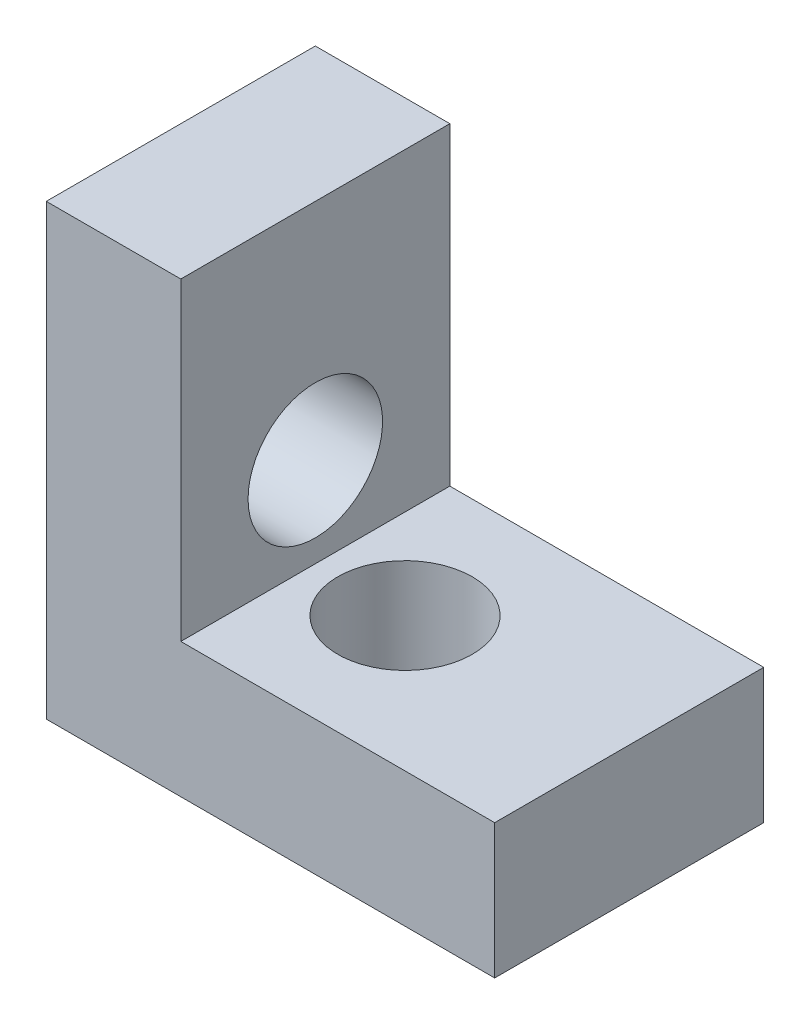
ISO-10303-21;
HEADER;
FILE_DESCRIPTION(('STEP AP214'),'2;1');
FILE_NAME('part.step','',(''),(''),'','','');
FILE_SCHEMA(('AUTOMOTIVE_DESIGN { 1 0 10303 214 1 1 1 1 }'));
ENDSEC;
DATA;
#1=APPLICATION_CONTEXT('core data for automotive mechanical design processes');
#2=APPLICATION_PROTOCOL_DEFINITION('international standard','automotive_design',2000,#1);
#3=PRODUCT_CONTEXT('',#1,'mechanical');
#4=PRODUCT('Part','Part','',(#3));
#5=PRODUCT_RELATED_PRODUCT_CATEGORY('part','',(#4));
#6=PRODUCT_DEFINITION_FORMATION('','',#4);
#7=PRODUCT_DEFINITION_CONTEXT('part definition',#1,'design');
#8=PRODUCT_DEFINITION('design','',#6,#7);
#9=PRODUCT_DEFINITION_SHAPE('','',#8);
#10=(LENGTH_UNIT() NAMED_UNIT(*) SI_UNIT(.MILLI.,.METRE.));
#11=(NAMED_UNIT(*) PLANE_ANGLE_UNIT() SI_UNIT($,.RADIAN.));
#12=(NAMED_UNIT(*) SI_UNIT($,.STERADIAN.) SOLID_ANGLE_UNIT());
#13=UNCERTAINTY_MEASURE_WITH_UNIT(LENGTH_MEASURE(1.E-05),#10,'distance_accuracy_value','');
#14=(GEOMETRIC_REPRESENTATION_CONTEXT(3) GLOBAL_UNCERTAINTY_ASSIGNED_CONTEXT((#13)) GLOBAL_UNIT_ASSIGNED_CONTEXT((#10,
#11,#12)) REPRESENTATION_CONTEXT('',''));
#15=CARTESIAN_POINT('',(0.,0.,0.));
#16=DIRECTION('',(0.,0.,1.));
#17=DIRECTION('',(1.,0.,0.));
#18=AXIS2_PLACEMENT_3D('',#15,#16,#17);
#19=CARTESIAN_POINT('',(0.,3.,0.));
#20=DIRECTION('',(0.,-1.,0.));
#21=DIRECTION('',(0.,0.,-1.));
#22=AXIS2_PLACEMENT_3D('',#19,#20,#21);
#23=PLANE('',#22);
#24=CARTESIAN_POINT('',(0.,3.,0.));
#25=DIRECTION('',(0.,-1.,0.));
#26=DIRECTION('',(0.,0.,-1.));
#27=AXIS2_PLACEMENT_3D('',#24,#25,#26);
#28=CIRCLE('',#27,1.5);
#29=CARTESIAN_POINT('',(0.,3.,-1.5));
#30=VERTEX_POINT('',#29);
#31=EDGE_CURVE('E156',#30,#30,#28,.F.);
#32=ORIENTED_EDGE('',*,*,#31,.F.);
#33=EDGE_LOOP('',(#32));
#34=FACE_BOUND('',#33,.T.);
#35=DIRECTION('',(0.,0.,-1.));
#36=VECTOR('',#35,1.);
#37=CARTESIAN_POINT('',(-2.,3.,-3.));
#38=LINE('',#37,#36);
#39=CARTESIAN_POINT('',(-2.,3.,3.));
#40=VERTEX_POINT('',#39);
#41=CARTESIAN_POINT('',(-2.,3.,-3.));
#42=VERTEX_POINT('',#41);
#43=EDGE_CURVE('E59',#40,#42,#38,.T.);
#44=ORIENTED_EDGE('',*,*,#43,.F.);
#45=DIRECTION('',(1.,0.,0.));
#46=VECTOR('',#45,1.);
#47=CARTESIAN_POINT('',(-5.,3.,3.));
#48=LINE('',#47,#46);
#49=CARTESIAN_POINT('',(5.,3.,3.));
#50=VERTEX_POINT('',#49);
#51=EDGE_CURVE('E64',#40,#50,#48,.T.);
#52=ORIENTED_EDGE('',*,*,#51,.T.);
#53=DIRECTION('',(0.,0.,-1.));
#54=VECTOR('',#53,1.);
#55=CARTESIAN_POINT('',(5.,3.,3.));
#56=LINE('',#55,#54);
#57=CARTESIAN_POINT('',(5.,3.,-3.));
#58=VERTEX_POINT('',#57);
#59=EDGE_CURVE('E96',#50,#58,#56,.T.);
#60=ORIENTED_EDGE('',*,*,#59,.T.);
#61=DIRECTION('',(-1.,0.,0.));
#62=VECTOR('',#61,1.);
#63=CARTESIAN_POINT('',(-5.,3.,-3.));
#64=LINE('',#63,#62);
#65=EDGE_CURVE('E159',#58,#42,#64,.T.);
#66=ORIENTED_EDGE('',*,*,#65,.T.);
#67=EDGE_LOOP('',(#44,#52,#60,#66));
#68=FACE_BOUND('',#67,.T.);
#69=ADVANCED_FACE('F43',(#34,#68),#23,.F.);
#70=CARTESIAN_POINT('',(5.,3.,3.));
#71=DIRECTION('',(-1.,0.,0.));
#72=DIRECTION('',(0.,0.,1.));
#73=AXIS2_PLACEMENT_3D('',#70,#71,#72);
#74=PLANE('',#73);
#75=DIRECTION('',(0.,0.,-1.));
#76=VECTOR('',#75,1.);
#77=CARTESIAN_POINT('',(5.,0.,3.));
#78=LINE('',#77,#76);
#79=CARTESIAN_POINT('',(5.,0.,3.));
#80=VERTEX_POINT('',#79);
#81=CARTESIAN_POINT('',(5.,0.,-3.));
#82=VERTEX_POINT('',#81);
#83=EDGE_CURVE('E102',#80,#82,#78,.T.);
#84=ORIENTED_EDGE('',*,*,#83,.T.);
#85=DIRECTION('',(0.,-1.,0.));
#86=VECTOR('',#85,1.);
#87=CARTESIAN_POINT('',(5.,3.,-3.));
#88=LINE('',#87,#86);
#89=EDGE_CURVE('E11',#58,#82,#88,.T.);
#90=ORIENTED_EDGE('',*,*,#89,.F.);
#91=ORIENTED_EDGE('',*,*,#59,.F.);
#92=DIRECTION('',(0.,-1.,0.));
#93=VECTOR('',#92,1.);
#94=CARTESIAN_POINT('',(5.,3.,3.));
#95=LINE('',#94,#93);
#96=EDGE_CURVE('E87',#50,#80,#95,.T.);
#97=ORIENTED_EDGE('',*,*,#96,.T.);
#98=EDGE_LOOP('',(#84,#90,#91,#97));
#99=FACE_BOUND('',#98,.T.);
#100=ADVANCED_FACE('F45',(#99),#74,.F.);
#101=CARTESIAN_POINT('',(-5.,3.,-3.));
#102=DIRECTION('',(0.,0.,1.));
#103=DIRECTION('',(1.,0.,0.));
#104=AXIS2_PLACEMENT_3D('',#101,#102,#103);
#105=PLANE('',#104);
#106=DIRECTION('',(-1.,0.,0.));
#107=VECTOR('',#106,1.);
#108=CARTESIAN_POINT('',(-5.,0.,-3.));
#109=LINE('',#108,#107);
#110=CARTESIAN_POINT('',(-5.,0.,-3.));
#111=VERTEX_POINT('',#110);
#112=EDGE_CURVE('E106',#82,#111,#109,.T.);
#113=ORIENTED_EDGE('',*,*,#112,.T.);
#114=DIRECTION('',(0.,-1.,0.));
#115=VECTOR('',#114,1.);
#116=CARTESIAN_POINT('',(-5.,3.,-3.));
#117=LINE('',#116,#115);
#118=CARTESIAN_POINT('',(-5.,10.,-3.));
#119=VERTEX_POINT('',#118);
#120=EDGE_CURVE('E52',#119,#111,#117,.T.);
#121=ORIENTED_EDGE('',*,*,#120,.F.);
#122=DIRECTION('',(-1.,0.,0.));
#123=VECTOR('',#122,1.);
#124=CARTESIAN_POINT('',(-5.,10.,-3.));
#125=LINE('',#124,#123);
#126=CARTESIAN_POINT('',(-2.,10.,-3.));
#127=VERTEX_POINT('',#126);
#128=EDGE_CURVE('E136',#127,#119,#125,.T.);
#129=ORIENTED_EDGE('',*,*,#128,.F.);
#130=DIRECTION('',(0.,-1.,0.));
#131=VECTOR('',#130,1.);
#132=CARTESIAN_POINT('',(-2.,10.,-3.));
#133=LINE('',#132,#131);
#134=EDGE_CURVE('E114',#127,#42,#133,.T.);
#135=ORIENTED_EDGE('',*,*,#134,.T.);
#136=ORIENTED_EDGE('',*,*,#65,.F.);
#137=ORIENTED_EDGE('',*,*,#89,.T.);
#138=EDGE_LOOP('',(#113,#121,#129,#135,#136,#137));
#139=FACE_BOUND('',#138,.T.);
#140=ADVANCED_FACE('F133',(#139),#105,.F.);
#141=CARTESIAN_POINT('',(-5.,3.,3.));
#142=DIRECTION('',(1.,0.,0.));
#143=DIRECTION('',(0.,0.,-1.));
#144=AXIS2_PLACEMENT_3D('',#141,#142,#143);
#145=PLANE('',#144);
#146=CARTESIAN_POINT('',(-5.,5.,0.));
#147=DIRECTION('',(-1.,0.,0.));
#148=DIRECTION('',(0.,0.,1.));
#149=AXIS2_PLACEMENT_3D('',#146,#147,#148);
#150=CIRCLE('',#149,1.5);
#151=CARTESIAN_POINT('',(-5.,5.,1.5));
#152=VERTEX_POINT('',#151);
#153=EDGE_CURVE('E185',#152,#152,#150,.T.);
#154=ORIENTED_EDGE('',*,*,#153,.F.);
#155=EDGE_LOOP('',(#154));
#156=FACE_BOUND('',#155,.T.);
#157=DIRECTION('',(0.,0.,1.));
#158=VECTOR('',#157,1.);
#159=CARTESIAN_POINT('',(-5.,0.,3.));
#160=LINE('',#159,#158);
#161=CARTESIAN_POINT('',(-5.,0.,3.));
#162=VERTEX_POINT('',#161);
#163=EDGE_CURVE('E97',#111,#162,#160,.T.);
#164=ORIENTED_EDGE('',*,*,#163,.T.);
#165=DIRECTION('',(0.,-1.,0.));
#166=VECTOR('',#165,1.);
#167=CARTESIAN_POINT('',(-5.,3.,3.));
#168=LINE('',#167,#166);
#169=CARTESIAN_POINT('',(-5.,10.,3.));
#170=VERTEX_POINT('',#169);
#171=EDGE_CURVE('E91',#170,#162,#168,.T.);
#172=ORIENTED_EDGE('',*,*,#171,.F.);
#173=DIRECTION('',(0.,0.,1.));
#174=VECTOR('',#173,1.);
#175=CARTESIAN_POINT('',(-5.,10.,-3.));
#176=LINE('',#175,#174);
#177=EDGE_CURVE('E129',#119,#170,#176,.T.);
#178=ORIENTED_EDGE('',*,*,#177,.F.);
#179=ORIENTED_EDGE('',*,*,#120,.T.);
#180=EDGE_LOOP('',(#164,#172,#178,#179));
#181=FACE_BOUND('',#180,.T.);
#182=ADVANCED_FACE('F127',(#156,#181),#145,.F.);
#183=CARTESIAN_POINT('',(-5.,3.,3.));
#184=DIRECTION('',(0.,0.,-1.));
#185=DIRECTION('',(-1.,0.,0.));
#186=AXIS2_PLACEMENT_3D('',#183,#184,#185);
#187=PLANE('',#186);
#188=DIRECTION('',(1.,0.,0.));
#189=VECTOR('',#188,1.);
#190=CARTESIAN_POINT('',(-5.,0.,3.));
#191=LINE('',#190,#189);
#192=EDGE_CURVE('E84',#162,#80,#191,.T.);
#193=ORIENTED_EDGE('',*,*,#192,.T.);
#194=ORIENTED_EDGE('',*,*,#96,.F.);
#195=ORIENTED_EDGE('',*,*,#51,.F.);
#196=DIRECTION('',(0.,-1.,0.));
#197=VECTOR('',#196,1.);
#198=CARTESIAN_POINT('',(-2.,10.,3.));
#199=LINE('',#198,#197);
#200=CARTESIAN_POINT('',(-2.,10.,3.));
#201=VERTEX_POINT('',#200);
#202=EDGE_CURVE('E108',#201,#40,#199,.T.);
#203=ORIENTED_EDGE('',*,*,#202,.F.);
#204=DIRECTION('',(1.,0.,0.));
#205=VECTOR('',#204,1.);
#206=CARTESIAN_POINT('',(-5.,10.,3.));
#207=LINE('',#206,#205);
#208=EDGE_CURVE('E151',#170,#201,#207,.T.);
#209=ORIENTED_EDGE('',*,*,#208,.F.);
#210=ORIENTED_EDGE('',*,*,#171,.T.);
#211=EDGE_LOOP('',(#193,#194,#195,#203,#209,#210));
#212=FACE_BOUND('',#211,.T.);
#213=ADVANCED_FACE('F86',(#212),#187,.F.);
#214=CARTESIAN_POINT('',(0.,0.,0.));
#215=DIRECTION('',(0.,-1.,0.));
#216=DIRECTION('',(0.,0.,-1.));
#217=AXIS2_PLACEMENT_3D('',#214,#215,#216);
#218=PLANE('',#217);
#219=CARTESIAN_POINT('',(0.,0.,0.));
#220=DIRECTION('',(0.,-1.,0.));
#221=DIRECTION('',(0.,0.,-1.));
#222=AXIS2_PLACEMENT_3D('',#219,#220,#221);
#223=CIRCLE('',#222,1.5);
#224=CARTESIAN_POINT('',(0.,0.,-1.5));
#225=VERTEX_POINT('',#224);
#226=EDGE_CURVE('E177',#225,#225,#223,.T.);
#227=ORIENTED_EDGE('',*,*,#226,.F.);
#228=EDGE_LOOP('',(#227));
#229=FACE_BOUND('',#228,.T.);
#230=ORIENTED_EDGE('',*,*,#83,.F.);
#231=ORIENTED_EDGE('',*,*,#192,.F.);
#232=ORIENTED_EDGE('',*,*,#163,.F.);
#233=ORIENTED_EDGE('',*,*,#112,.F.);
#234=EDGE_LOOP('',(#230,#231,#232,#233));
#235=FACE_BOUND('',#234,.T.);
#236=ADVANCED_FACE('F105',(#229,#235),#218,.T.);
#237=CARTESIAN_POINT('',(-2.,10.,-3.));
#238=DIRECTION('',(-1.,0.,0.));
#239=DIRECTION('',(0.,0.,1.));
#240=AXIS2_PLACEMENT_3D('',#237,#238,#239);
#241=PLANE('',#240);
#242=CARTESIAN_POINT('',(-2.,5.,0.));
#243=DIRECTION('',(-1.,0.,0.));
#244=DIRECTION('',(0.,0.,1.));
#245=AXIS2_PLACEMENT_3D('',#242,#243,#244);
#246=CIRCLE('',#245,1.5);
#247=CARTESIAN_POINT('',(-2.,5.,1.5));
#248=VERTEX_POINT('',#247);
#249=EDGE_CURVE('E181',#248,#248,#246,.F.);
#250=ORIENTED_EDGE('',*,*,#249,.F.);
#251=EDGE_LOOP('',(#250));
#252=FACE_BOUND('',#251,.T.);
#253=ORIENTED_EDGE('',*,*,#43,.T.);
#254=ORIENTED_EDGE('',*,*,#134,.F.);
#255=DIRECTION('',(0.,0.,-1.));
#256=VECTOR('',#255,1.);
#257=CARTESIAN_POINT('',(-2.,10.,-3.));
#258=LINE('',#257,#256);
#259=EDGE_CURVE('E144',#201,#127,#258,.T.);
#260=ORIENTED_EDGE('',*,*,#259,.F.);
#261=ORIENTED_EDGE('',*,*,#202,.T.);
#262=EDGE_LOOP('',(#253,#254,#260,#261));
#263=FACE_BOUND('',#262,.T.);
#264=ADVANCED_FACE('F164',(#252,#263),#241,.F.);
#265=CARTESIAN_POINT('',(0.,10.,0.));
#266=DIRECTION('',(0.,1.,0.));
#267=DIRECTION('',(0.,0.,1.));
#268=AXIS2_PLACEMENT_3D('',#265,#266,#267);
#269=PLANE('',#268);
#270=ORIENTED_EDGE('',*,*,#177,.T.);
#271=ORIENTED_EDGE('',*,*,#208,.T.);
#272=ORIENTED_EDGE('',*,*,#259,.T.);
#273=ORIENTED_EDGE('',*,*,#128,.T.);
#274=EDGE_LOOP('',(#270,#271,#272,#273));
#275=FACE_BOUND('',#274,.T.);
#276=ADVANCED_FACE('F140',(#275),#269,.T.);
#277=CARTESIAN_POINT('',(0.,7.24264068711929,0.));
#278=DIRECTION('',(0.,-1.,0.));
#279=DIRECTION('',(0.,0.,-1.));
#280=AXIS2_PLACEMENT_3D('',#277,#278,#279);
#281=CYLINDRICAL_SURFACE('',#280,1.5);
#282=CARTESIAN_POINT('',(0.,3.,-1.5));
#283=CARTESIAN_POINT('',(0.,2.96875,-1.5));
#284=CARTESIAN_POINT('',(0.,2.9375,-1.5));
#285=CARTESIAN_POINT('',(0.,2.875,-1.5));
#286=CARTESIAN_POINT('',(0.,2.84375,-1.5));
#287=CARTESIAN_POINT('',(0.,2.78125,-1.5));
#288=CARTESIAN_POINT('',(0.,2.75,-1.5));
#289=CARTESIAN_POINT('',(0.,2.6875,-1.5));
#290=CARTESIAN_POINT('',(0.,2.65625,-1.5));
#291=CARTESIAN_POINT('',(0.,2.59375,-1.5));
#292=CARTESIAN_POINT('',(0.,2.5625,-1.5));
#293=CARTESIAN_POINT('',(0.,2.5,-1.5));
#294=CARTESIAN_POINT('',(0.,2.46875,-1.5));
#295=CARTESIAN_POINT('',(0.,2.40625,-1.5));
#296=CARTESIAN_POINT('',(0.,2.375,-1.5));
#297=CARTESIAN_POINT('',(0.,2.3125,-1.5));
#298=CARTESIAN_POINT('',(0.,2.28125,-1.5));
#299=CARTESIAN_POINT('',(0.,2.21875,-1.5));
#300=CARTESIAN_POINT('',(0.,2.1875,-1.5));
#301=CARTESIAN_POINT('',(0.,2.125,-1.5));
#302=CARTESIAN_POINT('',(0.,2.09375,-1.5));
#303=CARTESIAN_POINT('',(0.,2.03125,-1.5));
#304=CARTESIAN_POINT('',(0.,2.,-1.5));
#305=CARTESIAN_POINT('',(0.,1.9375,-1.5));
#306=CARTESIAN_POINT('',(0.,1.90625,-1.5));
#307=CARTESIAN_POINT('',(0.,1.84375,-1.5));
#308=CARTESIAN_POINT('',(0.,1.8125,-1.5));
#309=CARTESIAN_POINT('',(0.,1.75,-1.5));
#310=CARTESIAN_POINT('',(0.,1.71875,-1.5));
#311=CARTESIAN_POINT('',(0.,1.65625,-1.5));
#312=CARTESIAN_POINT('',(0.,1.625,-1.5));
#313=CARTESIAN_POINT('',(0.,1.5625,-1.5));
#314=CARTESIAN_POINT('',(0.,1.53125,-1.5));
#315=CARTESIAN_POINT('',(0.,1.46875,-1.5));
#316=CARTESIAN_POINT('',(0.,1.4375,-1.5));
#317=CARTESIAN_POINT('',(0.,1.375,-1.5));
#318=CARTESIAN_POINT('',(0.,1.34375,-1.5));
#319=CARTESIAN_POINT('',(0.,1.28125,-1.5));
#320=CARTESIAN_POINT('',(0.,1.25,-1.5));
#321=CARTESIAN_POINT('',(0.,1.1875,-1.5));
#322=CARTESIAN_POINT('',(0.,1.15625,-1.5));
#323=CARTESIAN_POINT('',(0.,1.09375,-1.5));
#324=CARTESIAN_POINT('',(0.,1.0625,-1.5));
#325=CARTESIAN_POINT('',(0.,1.,-1.5));
#326=CARTESIAN_POINT('',(0.,0.968750000000001,-1.5));
#327=CARTESIAN_POINT('',(0.,0.906250000000001,-1.5));
#328=CARTESIAN_POINT('',(0.,0.875000000000001,-1.5));
#329=CARTESIAN_POINT('',(0.,0.812500000000001,-1.5));
#330=CARTESIAN_POINT('',(0.,0.781250000000001,-1.5));
#331=CARTESIAN_POINT('',(0.,0.718750000000001,-1.5));
#332=CARTESIAN_POINT('',(0.,0.687500000000001,-1.5));
#333=CARTESIAN_POINT('',(0.,0.625000000000001,-1.5));
#334=CARTESIAN_POINT('',(0.,0.593750000000001,-1.5));
#335=CARTESIAN_POINT('',(0.,0.53125,-1.5));
#336=CARTESIAN_POINT('',(0.,0.5,-1.5));
#337=CARTESIAN_POINT('',(0.,0.4375,-1.5));
#338=CARTESIAN_POINT('',(0.,0.40625,-1.5));
#339=CARTESIAN_POINT('',(0.,0.34375,-1.5));
#340=CARTESIAN_POINT('',(0.,0.3125,-1.5));
#341=CARTESIAN_POINT('',(0.,0.25,-1.5));
#342=CARTESIAN_POINT('',(0.,0.21875,-1.5));
#343=CARTESIAN_POINT('',(0.,0.15625,-1.5));
#344=CARTESIAN_POINT('',(0.,0.125,-1.5));
#345=CARTESIAN_POINT('',(0.,0.0625000000000001,-1.5));
#346=CARTESIAN_POINT('',(0.,0.03125,-1.5));
#347=CARTESIAN_POINT('',(0.,0.,-1.5));
#348=B_SPLINE_CURVE_WITH_KNOTS('',3,(#282,#283,#284,#285,#286,#287,#288,#289,#290,#291,#292,
#293,#294,#295,#296,#297,#298,#299,#300,#301,#302,#303,#304,#305,#306,#307,#308,#309,#310,#311,
#312,#313,#314,#315,#316,#317,#318,#319,#320,#321,#322,#323,#324,#325,#326,#327,#328,#329,#330,
#331,#332,#333,#334,#335,#336,#337,#338,#339,#340,#341,#342,#343,#344,#345,#346,#347),
.UNSPECIFIED.,.F.,.F.,(4,2,2,2,2,2,2,2,2,2,2,2,2,2,2,2,2,2,2,2,2,2,2,2,2,2,2,2,2,2,2,2,4),(0.,
0.0937500000000001,0.1875,0.28125,0.375,0.46875,0.5625,0.656250000000001,0.750000000000001,
0.843750000000001,0.9375,1.03125,1.125,1.21875,1.3125,1.40625,1.5,1.59375,1.6875,1.78125,1.875,
1.96875,2.0625,2.15625,2.25,2.34375,2.4375,2.53125,2.625,2.71875,2.8125,2.90625,3.),.UNSPECIFIED.);
#349=EDGE_CURVE('BSEAM217',#30,#225,#348,.T.);
#350=ORIENTED_EDGE('',*,*,#31,.T.);
#351=ORIENTED_EDGE('',*,*,#226,.T.);
#352=ORIENTED_EDGE('',*,*,#349,.T.);
#353=ORIENTED_EDGE('',*,*,#349,.F.);
#354=EDGE_LOOP('',(#350,#352,#351,#353));
#355=FACE_BOUND('',#354,.T.);
#356=ADVANCED_FACE('F217',(#355),#281,.F.);
#357=CARTESIAN_POINT('',(2.24264068711929,5.,0.));
#358=DIRECTION('',(-1.,0.,0.));
#359=DIRECTION('',(0.,0.,1.));
#360=AXIS2_PLACEMENT_3D('',#357,#358,#359);
#361=CYLINDRICAL_SURFACE('',#360,1.5);
#362=ORIENTED_EDGE('',*,*,#249,.T.);
#363=EDGE_LOOP('',(#362));
#364=FACE_BOUND('',#363,.T.);
#365=ORIENTED_EDGE('',*,*,#153,.T.);
#366=EDGE_LOOP('',(#365));
#367=FACE_BOUND('',#366,.T.);
#368=ADVANCED_FACE('F190',(#364,#367),#361,.F.);
#369=CLOSED_SHELL('',(#69,#100,#140,#182,#213,#236,#264,#276,#356,#368));
#370=MANIFOLD_SOLID_BREP('B2',#369);
#371=ADVANCED_BREP_SHAPE_REPRESENTATION('',(#18,#370),#14);
#372=SHAPE_DEFINITION_REPRESENTATION(#9,#371);
ENDSEC;
END-ISO-10303-21;
